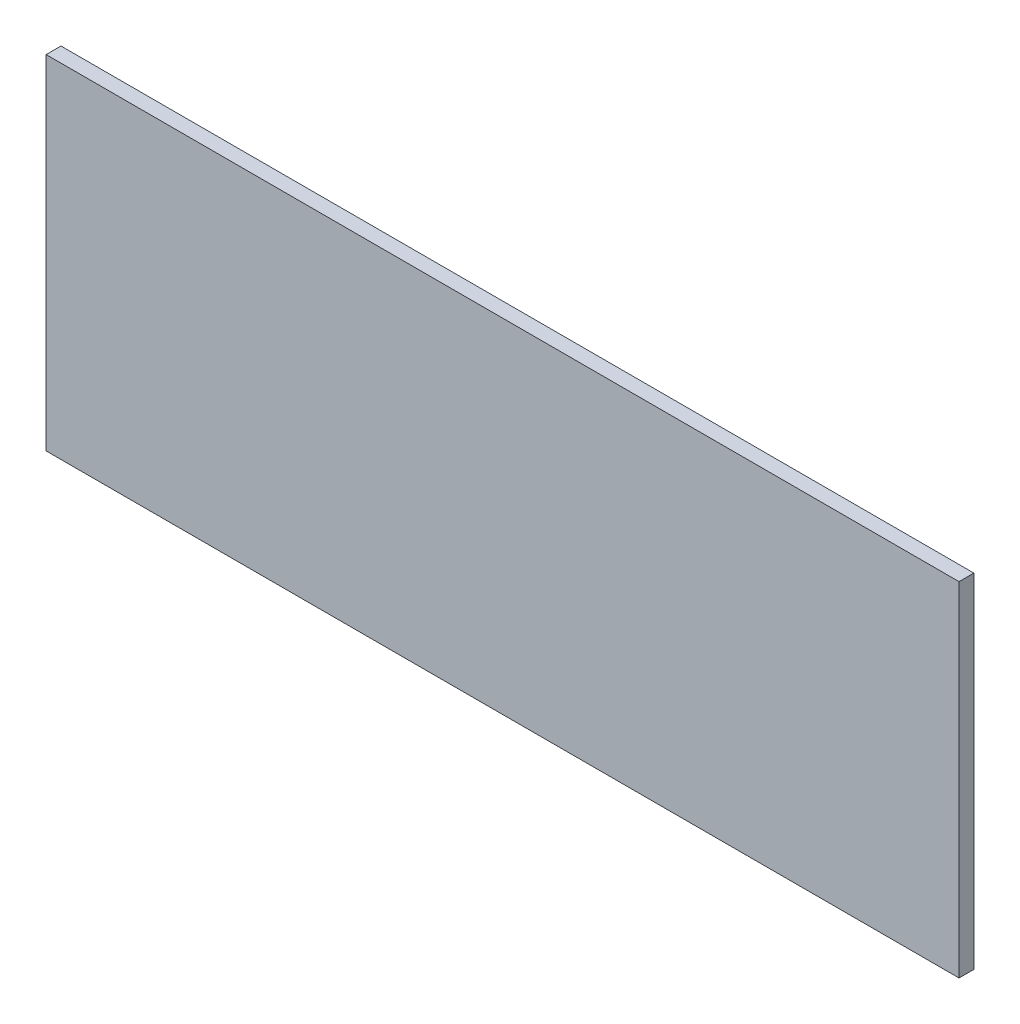
ISO-10303-21;
HEADER;
FILE_DESCRIPTION(('STEP AP214'),'2;1');
FILE_NAME('part.step','',(''),(''),'','','');
FILE_SCHEMA(('AUTOMOTIVE_DESIGN { 1 0 10303 214 1 1 1 1 }'));
ENDSEC;
DATA;
#1=APPLICATION_CONTEXT('core data for automotive mechanical design processes');
#2=APPLICATION_PROTOCOL_DEFINITION('international standard','automotive_design',2000,#1);
#3=PRODUCT_CONTEXT('',#1,'mechanical');
#4=PRODUCT('Part','Part','',(#3));
#5=PRODUCT_RELATED_PRODUCT_CATEGORY('part','',(#4));
#6=PRODUCT_DEFINITION_FORMATION('','',#4);
#7=PRODUCT_DEFINITION_CONTEXT('part definition',#1,'design');
#8=PRODUCT_DEFINITION('design','',#6,#7);
#9=PRODUCT_DEFINITION_SHAPE('','',#8);
#10=(LENGTH_UNIT() NAMED_UNIT(*) SI_UNIT(.MILLI.,.METRE.));
#11=(NAMED_UNIT(*) PLANE_ANGLE_UNIT() SI_UNIT($,.RADIAN.));
#12=(NAMED_UNIT(*) SI_UNIT($,.STERADIAN.) SOLID_ANGLE_UNIT());
#13=UNCERTAINTY_MEASURE_WITH_UNIT(LENGTH_MEASURE(1.E-05),#10,'distance_accuracy_value','');
#14=(GEOMETRIC_REPRESENTATION_CONTEXT(3) GLOBAL_UNCERTAINTY_ASSIGNED_CONTEXT((#13)) GLOBAL_UNIT_ASSIGNED_CONTEXT((#10,
#11,#12)) REPRESENTATION_CONTEXT('',''));
#15=CARTESIAN_POINT('',(0.,0.,0.));
#16=DIRECTION('',(0.,0.,1.));
#17=DIRECTION('',(1.,0.,0.));
#18=AXIS2_PLACEMENT_3D('',#15,#16,#17);
#19=CARTESIAN_POINT('',(-70.1075876153655,160.675947867299,8.));
#20=DIRECTION('',(1.,0.,0.));
#21=DIRECTION('',(0.,1.,0.));
#22=AXIS2_PLACEMENT_3D('',#19,#20,#21);
#23=PLANE('',#22);
#24=DIRECTION('',(0.,-1.,0.));
#25=VECTOR('',#24,1.);
#26=CARTESIAN_POINT('',(-70.1075876153655,160.675947867299,0.));
#27=LINE('',#26,#25);
#28=CARTESIAN_POINT('',(-70.1075876153655,160.675947867299,0.));
#29=VERTEX_POINT('',#28);
#30=CARTESIAN_POINT('',(-70.1075876153654,-24.3240521327014,0.));
#31=VERTEX_POINT('',#30);
#32=EDGE_CURVE('E97',#29,#31,#27,.T.);
#33=ORIENTED_EDGE('',*,*,#32,.T.);
#34=DIRECTION('',(0.,0.,-1.));
#35=VECTOR('',#34,1.);
#36=CARTESIAN_POINT('',(-70.1075876153654,-24.3240521327014,8.));
#37=LINE('',#36,#35);
#38=CARTESIAN_POINT('',(-70.1075876153654,-24.3240521327014,8.));
#39=VERTEX_POINT('',#38);
#40=EDGE_CURVE('E11',#39,#31,#37,.T.);
#41=ORIENTED_EDGE('',*,*,#40,.F.);
#42=DIRECTION('',(0.,-1.,0.));
#43=VECTOR('',#42,1.);
#44=CARTESIAN_POINT('',(-70.1075876153655,160.675947867299,8.));
#45=LINE('',#44,#43);
#46=CARTESIAN_POINT('',(-70.1075876153655,160.675947867299,8.));
#47=VERTEX_POINT('',#46);
#48=EDGE_CURVE('E85',#47,#39,#45,.T.);
#49=ORIENTED_EDGE('',*,*,#48,.F.);
#50=DIRECTION('',(0.,0.,-1.));
#51=VECTOR('',#50,1.);
#52=CARTESIAN_POINT('',(-70.1075876153655,160.675947867299,8.));
#53=LINE('',#52,#51);
#54=EDGE_CURVE('E93',#47,#29,#53,.T.);
#55=ORIENTED_EDGE('',*,*,#54,.T.);
#56=EDGE_LOOP('',(#33,#41,#49,#55));
#57=FACE_BOUND('',#56,.T.);
#58=ADVANCED_FACE('F34',(#57),#23,.F.);
#59=CARTESIAN_POINT('',(-70.1075876153654,-24.3240521327014,8.));
#60=DIRECTION('',(0.,1.,0.));
#61=DIRECTION('',(0.,0.,1.));
#62=AXIS2_PLACEMENT_3D('',#59,#60,#61);
#63=PLANE('',#62);
#64=DIRECTION('',(1.,0.,0.));
#65=VECTOR('',#64,1.);
#66=CARTESIAN_POINT('',(-70.1075876153654,-24.3240521327014,0.));
#67=LINE('',#66,#65);
#68=CARTESIAN_POINT('',(421.892412384635,-24.3240521327014,0.));
#69=VERTEX_POINT('',#68);
#70=EDGE_CURVE('E89',#31,#69,#67,.T.);
#71=ORIENTED_EDGE('',*,*,#70,.T.);
#72=DIRECTION('',(0.,0.,-1.));
#73=VECTOR('',#72,1.);
#74=CARTESIAN_POINT('',(421.892412384635,-24.3240521327014,8.));
#75=LINE('',#74,#73);
#76=CARTESIAN_POINT('',(421.892412384635,-24.3240521327014,8.));
#77=VERTEX_POINT('',#76);
#78=EDGE_CURVE('E42',#77,#69,#75,.T.);
#79=ORIENTED_EDGE('',*,*,#78,.F.);
#80=DIRECTION('',(1.,0.,0.));
#81=VECTOR('',#80,1.);
#82=CARTESIAN_POINT('',(-70.1075876153654,-24.3240521327014,8.));
#83=LINE('',#82,#81);
#84=EDGE_CURVE('E80',#39,#77,#83,.T.);
#85=ORIENTED_EDGE('',*,*,#84,.F.);
#86=ORIENTED_EDGE('',*,*,#40,.T.);
#87=EDGE_LOOP('',(#71,#79,#85,#86));
#88=FACE_BOUND('',#87,.T.);
#89=ADVANCED_FACE('F88',(#88),#63,.F.);
#90=CARTESIAN_POINT('',(421.892412384635,160.675947867299,8.));
#91=DIRECTION('',(-1.,0.,0.));
#92=DIRECTION('',(0.,-1.,0.));
#93=AXIS2_PLACEMENT_3D('',#90,#91,#92);
#94=PLANE('',#93);
#95=DIRECTION('',(0.,1.,0.));
#96=VECTOR('',#95,1.);
#97=CARTESIAN_POINT('',(421.892412384635,160.675947867299,0.));
#98=LINE('',#97,#96);
#99=CARTESIAN_POINT('',(421.892412384635,160.675947867299,0.));
#100=VERTEX_POINT('',#99);
#101=EDGE_CURVE('E67',#69,#100,#98,.T.);
#102=ORIENTED_EDGE('',*,*,#101,.T.);
#103=DIRECTION('',(0.,0.,-1.));
#104=VECTOR('',#103,1.);
#105=CARTESIAN_POINT('',(421.892412384635,160.675947867299,8.));
#106=LINE('',#105,#104);
#107=CARTESIAN_POINT('',(421.892412384635,160.675947867299,8.));
#108=VERTEX_POINT('',#107);
#109=EDGE_CURVE('E90',#108,#100,#106,.T.);
#110=ORIENTED_EDGE('',*,*,#109,.F.);
#111=DIRECTION('',(0.,1.,0.));
#112=VECTOR('',#111,1.);
#113=CARTESIAN_POINT('',(421.892412384635,160.675947867299,8.));
#114=LINE('',#113,#112);
#115=EDGE_CURVE('E83',#77,#108,#114,.T.);
#116=ORIENTED_EDGE('',*,*,#115,.F.);
#117=ORIENTED_EDGE('',*,*,#78,.T.);
#118=EDGE_LOOP('',(#102,#110,#116,#117));
#119=FACE_BOUND('',#118,.T.);
#120=ADVANCED_FACE('F91',(#119),#94,.F.);
#121=CARTESIAN_POINT('',(-70.1075876153655,160.675947867299,8.));
#122=DIRECTION('',(0.,-1.,0.));
#123=DIRECTION('',(0.,0.,-1.));
#124=AXIS2_PLACEMENT_3D('',#121,#122,#123);
#125=PLANE('',#124);
#126=DIRECTION('',(-1.,0.,0.));
#127=VECTOR('',#126,1.);
#128=CARTESIAN_POINT('',(-70.1075876153655,160.675947867299,0.));
#129=LINE('',#128,#127);
#130=EDGE_CURVE('E73',#100,#29,#129,.T.);
#131=ORIENTED_EDGE('',*,*,#130,.T.);
#132=ORIENTED_EDGE('',*,*,#54,.F.);
#133=DIRECTION('',(-1.,0.,0.));
#134=VECTOR('',#133,1.);
#135=CARTESIAN_POINT('',(-70.1075876153655,160.675947867299,8.));
#136=LINE('',#135,#134);
#137=EDGE_CURVE('E50',#108,#47,#136,.T.);
#138=ORIENTED_EDGE('',*,*,#137,.F.);
#139=ORIENTED_EDGE('',*,*,#109,.T.);
#140=EDGE_LOOP('',(#131,#132,#138,#139));
#141=FACE_BOUND('',#140,.T.);
#142=ADVANCED_FACE('F104',(#141),#125,.F.);
#143=CARTESIAN_POINT('',(0.,0.,8.));
#144=DIRECTION('',(0.,0.,1.));
#145=DIRECTION('',(1.,0.,0.));
#146=AXIS2_PLACEMENT_3D('',#143,#144,#145);
#147=PLANE('',#146);
#148=ORIENTED_EDGE('',*,*,#48,.T.);
#149=ORIENTED_EDGE('',*,*,#84,.T.);
#150=ORIENTED_EDGE('',*,*,#115,.T.);
#151=ORIENTED_EDGE('',*,*,#137,.T.);
#152=EDGE_LOOP('',(#148,#149,#150,#151));
#153=FACE_BOUND('',#152,.T.);
#154=ADVANCED_FACE('F81',(#153),#147,.T.);
#155=CARTESIAN_POINT('',(0.,0.,0.));
#156=DIRECTION('',(0.,0.,1.));
#157=DIRECTION('',(1.,0.,0.));
#158=AXIS2_PLACEMENT_3D('',#155,#156,#157);
#159=PLANE('',#158);
#160=ORIENTED_EDGE('',*,*,#32,.F.);
#161=ORIENTED_EDGE('',*,*,#130,.F.);
#162=ORIENTED_EDGE('',*,*,#101,.F.);
#163=ORIENTED_EDGE('',*,*,#70,.F.);
#164=EDGE_LOOP('',(#160,#161,#162,#163));
#165=FACE_BOUND('',#164,.T.);
#166=ADVANCED_FACE('F107',(#165),#159,.F.);
#167=CLOSED_SHELL('',(#58,#89,#120,#142,#154,#166));
#168=MANIFOLD_SOLID_BREP('B2',#167);
#169=ADVANCED_BREP_SHAPE_REPRESENTATION('',(#18,#168),#14);
#170=SHAPE_DEFINITION_REPRESENTATION(#9,#169);
ENDSEC;
END-ISO-10303-21;
